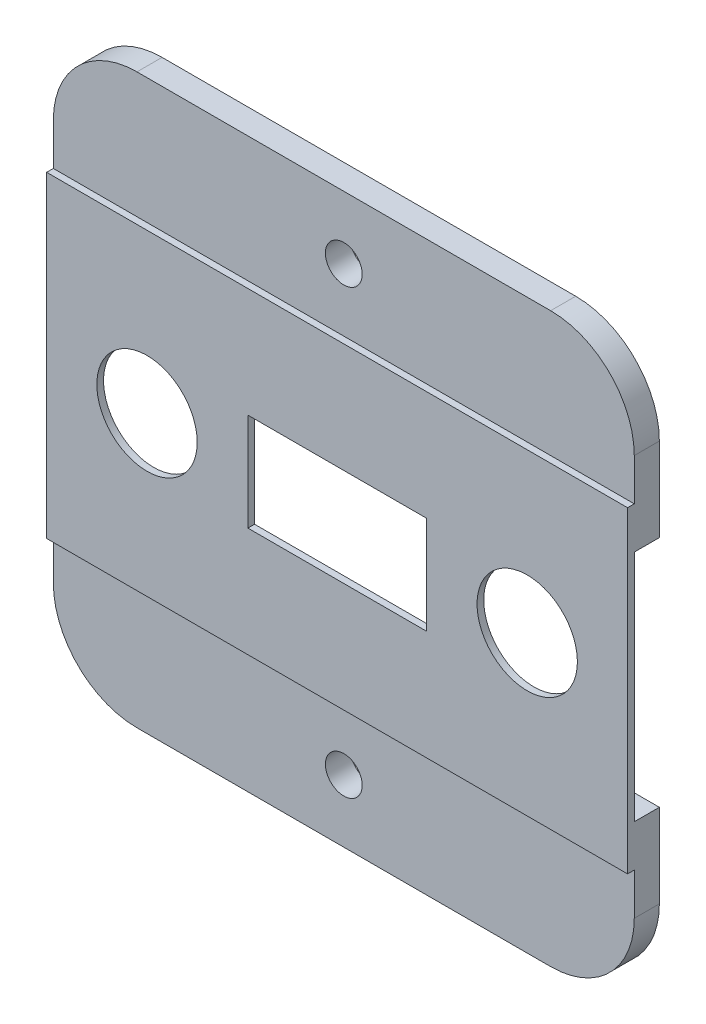
ISO-10303-21;
HEADER;
FILE_DESCRIPTION(('STEP AP214'),'2;1');
FILE_NAME('part.step','',(''),(''),'','','');
FILE_SCHEMA(('AUTOMOTIVE_DESIGN { 1 0 10303 214 1 1 1 1 }'));
ENDSEC;
DATA;
#1=APPLICATION_CONTEXT('core data for automotive mechanical design processes');
#2=APPLICATION_PROTOCOL_DEFINITION('international standard','automotive_design',2000,#1);
#3=PRODUCT_CONTEXT('',#1,'mechanical');
#4=PRODUCT('Part','Part','',(#3));
#5=PRODUCT_RELATED_PRODUCT_CATEGORY('part','',(#4));
#6=PRODUCT_DEFINITION_FORMATION('','',#4);
#7=PRODUCT_DEFINITION_CONTEXT('part definition',#1,'design');
#8=PRODUCT_DEFINITION('design','',#6,#7);
#9=PRODUCT_DEFINITION_SHAPE('','',#8);
#10=(LENGTH_UNIT() NAMED_UNIT(*) SI_UNIT(.MILLI.,.METRE.));
#11=(NAMED_UNIT(*) PLANE_ANGLE_UNIT() SI_UNIT($,.RADIAN.));
#12=(NAMED_UNIT(*) SI_UNIT($,.STERADIAN.) SOLID_ANGLE_UNIT());
#13=UNCERTAINTY_MEASURE_WITH_UNIT(LENGTH_MEASURE(1.E-05),#10,'distance_accuracy_value','');
#14=(GEOMETRIC_REPRESENTATION_CONTEXT(3) GLOBAL_UNCERTAINTY_ASSIGNED_CONTEXT((#13)) GLOBAL_UNIT_ASSIGNED_CONTEXT((#10,
#11,#12)) REPRESENTATION_CONTEXT('',''));
#15=CARTESIAN_POINT('',(0.,0.,0.));
#16=DIRECTION('',(0.,0.,1.));
#17=DIRECTION('',(1.,0.,0.));
#18=AXIS2_PLACEMENT_3D('',#15,#16,#17);
#19=CARTESIAN_POINT('',(0.,0.,1.90499999999993));
#20=DIRECTION('',(0.,0.,1.));
#21=DIRECTION('',(1.,0.,0.));
#22=AXIS2_PLACEMENT_3D('',#19,#20,#21);
#23=PLANE('',#22);
#24=CARTESIAN_POINT('',(-4.70269996774463,-10.6854,1.90499999999993));
#25=DIRECTION('',(0.,0.,1.));
#26=DIRECTION('',(1.,0.,0.));
#27=AXIS2_PLACEMENT_3D('',#24,#25,#26);
#28=CIRCLE('',#27,1.39699999999999);
#29=CARTESIAN_POINT('',(-3.30569996774464,-10.6854,1.90499999999993));
#30=VERTEX_POINT('',#29);
#31=EDGE_CURVE('E379',#30,#30,#28,.T.);
#32=ORIENTED_EDGE('',*,*,#31,.F.);
#33=EDGE_LOOP('',(#32));
#34=FACE_BOUND('',#33,.T.);
#35=DIRECTION('',(-1.,0.,0.));
#36=VECTOR('',#35,1.);
#37=CARTESIAN_POINT('',(17.3508500322554,-15.4479,1.90499999999993));
#38=LINE('',#37,#36);
#39=CARTESIAN_POINT('',(17.3508500322554,-15.4479,1.90499999999993));
#40=VERTEX_POINT('',#39);
#41=CARTESIAN_POINT('',(-26.7562499677446,-15.4479,1.90499999999993));
#42=VERTEX_POINT('',#41);
#43=EDGE_CURVE('E48',#40,#42,#38,.T.);
#44=ORIENTED_EDGE('',*,*,#43,.F.);
#45=DIRECTION('',(0.,1.,0.));
#46=VECTOR('',#45,1.);
#47=CARTESIAN_POINT('',(17.3508500322554,-18.6229,1.90499999999993));
#48=LINE('',#47,#46);
#49=CARTESIAN_POINT('',(17.3508500322554,-12.2729,1.90499999999993));
#50=VERTEX_POINT('',#49);
#51=EDGE_CURVE('E299',#40,#50,#48,.T.);
#52=ORIENTED_EDGE('',*,*,#51,.T.);
#53=CARTESIAN_POINT('',(11.0008500322554,-12.2729,1.90499999999993));
#54=DIRECTION('',(0.,0.,1.));
#55=DIRECTION('',(1.,0.,0.));
#56=AXIS2_PLACEMENT_3D('',#53,#54,#55);
#57=CIRCLE('',#56,6.35);
#58=CARTESIAN_POINT('',(11.0008500322554,-5.92289999999998,1.90499999999993));
#59=VERTEX_POINT('',#58);
#60=EDGE_CURVE('E320',#59,#50,#57,.F.);
#61=ORIENTED_EDGE('',*,*,#60,.F.);
#62=DIRECTION('',(1.,0.,0.));
#63=VECTOR('',#62,1.);
#64=CARTESIAN_POINT('',(-20.4062499677446,-5.92289999999999,1.90499999999993));
#65=LINE('',#64,#63);
#66=CARTESIAN_POINT('',(-20.4062499677446,-5.92289999999999,1.90499999999993));
#67=VERTEX_POINT('',#66);
#68=EDGE_CURVE('E325',#67,#59,#65,.T.);
#69=ORIENTED_EDGE('',*,*,#68,.F.);
#70=CARTESIAN_POINT('',(-20.4062499677446,-12.2729,1.90499999999993));
#71=DIRECTION('',(0.,0.,1.));
#72=DIRECTION('',(1.,0.,0.));
#73=AXIS2_PLACEMENT_3D('',#70,#71,#72);
#74=CIRCLE('',#73,6.35);
#75=CARTESIAN_POINT('',(-26.7562499677446,-12.2729,1.90499999999993));
#76=VERTEX_POINT('',#75);
#77=EDGE_CURVE('E329',#76,#67,#74,.F.);
#78=ORIENTED_EDGE('',*,*,#77,.F.);
#79=DIRECTION('',(0.,1.,0.));
#80=VECTOR('',#79,1.);
#81=CARTESIAN_POINT('',(-26.7562499677446,-18.6229,1.90499999999993));
#82=LINE('',#81,#80);
#83=EDGE_CURVE('E333',#42,#76,#82,.T.);
#84=ORIENTED_EDGE('',*,*,#83,.F.);
#85=EDGE_LOOP('',(#44,#52,#61,#69,#78,#84));
#86=FACE_BOUND('',#85,.T.);
#87=ADVANCED_FACE('F33',(#34,#86),#23,.T.);
#88=CARTESIAN_POINT('',(11.0008500322554,-12.2729,0.));
#89=DIRECTION('',(0.,0.,-1.));
#90=DIRECTION('',(-1.,0.,0.));
#91=AXIS2_PLACEMENT_3D('',#88,#89,#90);
#92=PLANE('',#91);
#93=CARTESIAN_POINT('',(-4.70269996774463,-10.6854,0.));
#94=DIRECTION('',(0.,0.,1.));
#95=DIRECTION('',(1.,0.,0.));
#96=AXIS2_PLACEMENT_3D('',#93,#94,#95);
#97=CIRCLE('',#96,1.397);
#98=CARTESIAN_POINT('',(-3.30569996774463,-10.6854,0.));
#99=VERTEX_POINT('',#98);
#100=EDGE_CURVE('E381',#99,#99,#97,.T.);
#101=ORIENTED_EDGE('',*,*,#100,.T.);
#102=EDGE_LOOP('',(#101));
#103=FACE_BOUND('',#102,.T.);
#104=DIRECTION('',(0.,1.,0.));
#105=VECTOR('',#104,1.);
#106=CARTESIAN_POINT('',(17.3508500322554,-18.6229,0.));
#107=LINE('',#106,#105);
#108=CARTESIAN_POINT('',(17.3508500322554,-18.6229,0.));
#109=VERTEX_POINT('',#108);
#110=CARTESIAN_POINT('',(17.3508500322554,-12.2729,0.));
#111=VERTEX_POINT('',#110);
#112=EDGE_CURVE('E11',#109,#111,#107,.T.);
#113=ORIENTED_EDGE('',*,*,#112,.F.);
#114=DIRECTION('',(-1.,0.,0.));
#115=VECTOR('',#114,1.);
#116=CARTESIAN_POINT('',(17.3508500322554,-18.6229,0.));
#117=LINE('',#116,#115);
#118=CARTESIAN_POINT('',(-26.7562499677446,-18.6229,0.));
#119=VERTEX_POINT('',#118);
#120=EDGE_CURVE('E300',#109,#119,#117,.T.);
#121=ORIENTED_EDGE('',*,*,#120,.T.);
#122=DIRECTION('',(0.,1.,0.));
#123=VECTOR('',#122,1.);
#124=CARTESIAN_POINT('',(-26.7562499677446,-18.6229,0.));
#125=LINE('',#124,#123);
#126=CARTESIAN_POINT('',(-26.7562499677446,-12.2729,0.));
#127=VERTEX_POINT('',#126);
#128=EDGE_CURVE('E303',#119,#127,#125,.T.);
#129=ORIENTED_EDGE('',*,*,#128,.T.);
#130=CARTESIAN_POINT('',(-20.4062499677446,-12.2729,0.));
#131=DIRECTION('',(0.,0.,-1.));
#132=DIRECTION('',(-1.,0.,0.));
#133=AXIS2_PLACEMENT_3D('',#130,#131,#132);
#134=CIRCLE('',#133,6.35);
#135=CARTESIAN_POINT('',(-20.4062499677446,-5.92289999999999,0.));
#136=VERTEX_POINT('',#135);
#137=EDGE_CURVE('E306',#127,#136,#134,.T.);
#138=ORIENTED_EDGE('',*,*,#137,.T.);
#139=DIRECTION('',(1.,0.,0.));
#140=VECTOR('',#139,1.);
#141=CARTESIAN_POINT('',(-20.4062499677446,-5.92289999999999,0.));
#142=LINE('',#141,#140);
#143=CARTESIAN_POINT('',(11.0008500322554,-5.92289999999998,0.));
#144=VERTEX_POINT('',#143);
#145=EDGE_CURVE('E309',#136,#144,#142,.T.);
#146=ORIENTED_EDGE('',*,*,#145,.T.);
#147=CARTESIAN_POINT('',(11.0008500322554,-12.2729,0.));
#148=DIRECTION('',(0.,0.,-1.));
#149=DIRECTION('',(-1.,0.,0.));
#150=AXIS2_PLACEMENT_3D('',#147,#148,#149);
#151=CIRCLE('',#150,6.35);
#152=EDGE_CURVE('E312',#144,#111,#151,.T.);
#153=ORIENTED_EDGE('',*,*,#152,.T.);
#154=EDGE_LOOP('',(#113,#121,#129,#138,#146,#153));
#155=FACE_BOUND('',#154,.T.);
#156=ADVANCED_FACE('F347',(#103,#155),#92,.T.);
#157=CARTESIAN_POINT('',(17.3508500322554,-18.6229,48.1850879039006));
#158=DIRECTION('',(0.,-1.,0.));
#159=DIRECTION('',(1.,0.,0.));
#160=AXIS2_PLACEMENT_3D('',#157,#158,#159);
#161=PLANE('',#160);
#162=DIRECTION('',(0.,0.,-1.));
#163=VECTOR('',#162,1.);
#164=CARTESIAN_POINT('',(17.3508500322554,-18.6229,48.1850879039006));
#165=LINE('',#164,#163);
#166=CARTESIAN_POINT('',(17.3508500322554,-18.6229,1.90499999999993));
#167=VERTEX_POINT('',#166);
#168=EDGE_CURVE('E36',#167,#109,#165,.T.);
#169=ORIENTED_EDGE('',*,*,#168,.F.);
#170=DIRECTION('',(-1.,0.,0.));
#171=VECTOR('',#170,1.);
#172=CARTESIAN_POINT('',(17.3508500322554,-18.6229,1.90499999999993));
#173=LINE('',#172,#171);
#174=CARTESIAN_POINT('',(-26.7562499677446,-18.6229,1.90499999999993));
#175=VERTEX_POINT('',#174);
#176=EDGE_CURVE('E314',#167,#175,#173,.T.);
#177=ORIENTED_EDGE('',*,*,#176,.T.);
#178=DIRECTION('',(0.,0.,-1.));
#179=VECTOR('',#178,1.);
#180=CARTESIAN_POINT('',(-26.7562499677446,-18.6229,48.1850879039006));
#181=LINE('',#180,#179);
#182=EDGE_CURVE('E318',#175,#119,#181,.T.);
#183=ORIENTED_EDGE('',*,*,#182,.T.);
#184=ORIENTED_EDGE('',*,*,#120,.F.);
#185=EDGE_LOOP('',(#169,#177,#183,#184));
#186=FACE_BOUND('',#185,.T.);
#187=ADVANCED_FACE('F341',(#186),#161,.T.);
#188=CARTESIAN_POINT('',(-26.7562499677446,-18.6229,48.1850879039006));
#189=DIRECTION('',(-1.,0.,0.));
#190=DIRECTION('',(0.,0.,1.));
#191=AXIS2_PLACEMENT_3D('',#188,#189,#190);
#192=PLANE('',#191);
#193=ORIENTED_EDGE('',*,*,#182,.F.);
#194=DIRECTION('',(0.,-1.,0.));
#195=VECTOR('',#194,1.);
#196=CARTESIAN_POINT('',(-26.7562499677446,-15.4479,1.90499999999993));
#197=LINE('',#196,#195);
#198=CARTESIAN_POINT('',(-26.7562499677446,-36.3520999999999,1.90499999999993));
#199=VERTEX_POINT('',#198);
#200=EDGE_CURVE('E285',#175,#199,#197,.T.);
#201=ORIENTED_EDGE('',*,*,#200,.T.);
#202=DIRECTION('',(0.,0.,-1.));
#203=VECTOR('',#202,1.);
#204=CARTESIAN_POINT('',(-26.7562499677446,-36.3520999999999,48.1850879039006));
#205=LINE('',#204,#203);
#206=CARTESIAN_POINT('',(-26.7562499677446,-36.3520999999999,0.));
#207=VERTEX_POINT('',#206);
#208=EDGE_CURVE('E225',#199,#207,#205,.T.);
#209=ORIENTED_EDGE('',*,*,#208,.T.);
#210=DIRECTION('',(0.,-1.,0.));
#211=VECTOR('',#210,1.);
#212=CARTESIAN_POINT('',(-26.7562499677446,-36.3520999999999,0.));
#213=LINE('',#212,#211);
#214=CARTESIAN_POINT('',(-26.7562499677446,-42.7020999999999,0.));
#215=VERTEX_POINT('',#214);
#216=EDGE_CURVE('E194',#207,#215,#213,.T.);
#217=ORIENTED_EDGE('',*,*,#216,.T.);
#218=DIRECTION('',(0.,0.,-1.));
#219=VECTOR('',#218,1.);
#220=CARTESIAN_POINT('',(-26.7562499677446,-42.7020999999999,48.1850879039006));
#221=LINE('',#220,#219);
#222=CARTESIAN_POINT('',(-26.7562499677446,-42.7020999999999,1.90499999999993));
#223=VERTEX_POINT('',#222);
#224=EDGE_CURVE('E190',#223,#215,#221,.T.);
#225=ORIENTED_EDGE('',*,*,#224,.F.);
#226=DIRECTION('',(0.,-1.,0.));
#227=VECTOR('',#226,1.);
#228=CARTESIAN_POINT('',(-26.7562499677446,-36.3520999999999,1.90499999999993));
#229=LINE('',#228,#227);
#230=CARTESIAN_POINT('',(-26.7562499677446,-39.5270999999999,1.90499999999993));
#231=VERTEX_POINT('',#230);
#232=EDGE_CURVE('E175',#231,#223,#229,.T.);
#233=ORIENTED_EDGE('',*,*,#232,.F.);
#234=DIRECTION('',(0.,0.,-1.));
#235=VECTOR('',#234,1.);
#236=CARTESIAN_POINT('',(-26.7562499677446,-39.5270999999999,2.41299999999993));
#237=LINE('',#236,#235);
#238=CARTESIAN_POINT('',(-26.7562499677446,-39.5270999999999,2.41299999999993));
#239=VERTEX_POINT('',#238);
#240=EDGE_CURVE('E291',#239,#231,#237,.T.);
#241=ORIENTED_EDGE('',*,*,#240,.F.);
#242=DIRECTION('',(0.,-1.,0.));
#243=VECTOR('',#242,1.);
#244=CARTESIAN_POINT('',(-26.7562499677446,-15.4479,2.41299999999993));
#245=LINE('',#244,#243);
#246=CARTESIAN_POINT('',(-26.7562499677446,-15.4479,2.41299999999993));
#247=VERTEX_POINT('',#246);
#248=EDGE_CURVE('E278',#247,#239,#245,.T.);
#249=ORIENTED_EDGE('',*,*,#248,.F.);
#250=DIRECTION('',(0.,0.,-1.));
#251=VECTOR('',#250,1.);
#252=CARTESIAN_POINT('',(-26.7562499677446,-15.4479,2.41299999999993));
#253=LINE('',#252,#251);
#254=EDGE_CURVE('E293',#247,#42,#253,.T.);
#255=ORIENTED_EDGE('',*,*,#254,.T.);
#256=ORIENTED_EDGE('',*,*,#83,.T.);
#257=DIRECTION('',(0.,0.,-1.));
#258=VECTOR('',#257,1.);
#259=CARTESIAN_POINT('',(-26.7562499677446,-12.2729,48.1850879039006));
#260=LINE('',#259,#258);
#261=EDGE_CURVE('E332',#76,#127,#260,.T.);
#262=ORIENTED_EDGE('',*,*,#261,.T.);
#263=ORIENTED_EDGE('',*,*,#128,.F.);
#264=EDGE_LOOP('',(#193,#201,#209,#217,#225,#233,#241,#249,#255,#256,#262,#263));
#265=FACE_BOUND('',#264,.T.);
#266=ADVANCED_FACE('F192',(#265),#192,.T.);
#267=CARTESIAN_POINT('',(-20.4062499677446,-12.2729,48.1850879039006));
#268=DIRECTION('',(0.,0.,-1.));
#269=DIRECTION('',(-1.,0.,0.));
#270=AXIS2_PLACEMENT_3D('',#267,#268,#269);
#271=CYLINDRICAL_SURFACE('',#270,6.35);
#272=ORIENTED_EDGE('',*,*,#261,.F.);
#273=ORIENTED_EDGE('',*,*,#77,.T.);
#274=DIRECTION('',(0.,0.,-1.));
#275=VECTOR('',#274,1.);
#276=CARTESIAN_POINT('',(-20.4062499677446,-5.92289999999999,48.1850879039006));
#277=LINE('',#276,#275);
#278=EDGE_CURVE('E328',#67,#136,#277,.T.);
#279=ORIENTED_EDGE('',*,*,#278,.T.);
#280=ORIENTED_EDGE('',*,*,#137,.F.);
#281=EDGE_LOOP('',(#272,#273,#279,#280));
#282=FACE_BOUND('',#281,.T.);
#283=ADVANCED_FACE('F361',(#282),#271,.T.);
#284=CARTESIAN_POINT('',(-20.4062499677446,-5.92289999999999,48.1850879039006));
#285=DIRECTION('',(0.,1.,0.));
#286=DIRECTION('',(-1.,0.,0.));
#287=AXIS2_PLACEMENT_3D('',#284,#285,#286);
#288=PLANE('',#287);
#289=ORIENTED_EDGE('',*,*,#278,.F.);
#290=ORIENTED_EDGE('',*,*,#68,.T.);
#291=DIRECTION('',(0.,0.,-1.));
#292=VECTOR('',#291,1.);
#293=CARTESIAN_POINT('',(11.0008500322554,-5.92289999999998,48.1850879039006));
#294=LINE('',#293,#292);
#295=EDGE_CURVE('E324',#59,#144,#294,.T.);
#296=ORIENTED_EDGE('',*,*,#295,.T.);
#297=ORIENTED_EDGE('',*,*,#145,.F.);
#298=EDGE_LOOP('',(#289,#290,#296,#297));
#299=FACE_BOUND('',#298,.T.);
#300=ADVANCED_FACE('F359',(#299),#288,.T.);
#301=CARTESIAN_POINT('',(11.0008500322554,-12.2729,48.1850879039006));
#302=DIRECTION('',(0.,0.,-1.));
#303=DIRECTION('',(-1.,0.,0.));
#304=AXIS2_PLACEMENT_3D('',#301,#302,#303);
#305=CYLINDRICAL_SURFACE('',#304,6.35);
#306=ORIENTED_EDGE('',*,*,#295,.F.);
#307=ORIENTED_EDGE('',*,*,#60,.T.);
#308=DIRECTION('',(0.,0.,-1.));
#309=VECTOR('',#308,1.);
#310=CARTESIAN_POINT('',(17.3508500322554,-12.2729,48.1850879039006));
#311=LINE('',#310,#309);
#312=EDGE_CURVE('E323',#50,#111,#311,.T.);
#313=ORIENTED_EDGE('',*,*,#312,.T.);
#314=ORIENTED_EDGE('',*,*,#152,.F.);
#315=EDGE_LOOP('',(#306,#307,#313,#314));
#316=FACE_BOUND('',#315,.T.);
#317=ADVANCED_FACE('F354',(#316),#305,.T.);
#318=CARTESIAN_POINT('',(17.3508500322554,-18.6229,48.1850879039006));
#319=DIRECTION('',(-1.,0.,0.));
#320=DIRECTION('',(0.,-1.,0.));
#321=AXIS2_PLACEMENT_3D('',#318,#319,#320);
#322=PLANE('',#321);
#323=ORIENTED_EDGE('',*,*,#51,.F.);
#324=DIRECTION('',(0.,0.,-1.));
#325=VECTOR('',#324,1.);
#326=CARTESIAN_POINT('',(17.3508500322554,-15.4479,2.41299999999993));
#327=LINE('',#326,#325);
#328=CARTESIAN_POINT('',(17.3508500322554,-15.4479,2.41299999999993));
#329=VERTEX_POINT('',#328);
#330=EDGE_CURVE('E296',#329,#40,#327,.T.);
#331=ORIENTED_EDGE('',*,*,#330,.F.);
#332=DIRECTION('',(0.,1.,0.));
#333=VECTOR('',#332,1.);
#334=CARTESIAN_POINT('',(17.3508500322554,-39.5270999999999,2.41299999999993));
#335=LINE('',#334,#333);
#336=CARTESIAN_POINT('',(17.3508500322554,-39.5270999999999,2.41299999999993));
#337=VERTEX_POINT('',#336);
#338=EDGE_CURVE('E273',#337,#329,#335,.T.);
#339=ORIENTED_EDGE('',*,*,#338,.F.);
#340=DIRECTION('',(0.,0.,-1.));
#341=VECTOR('',#340,1.);
#342=CARTESIAN_POINT('',(17.3508500322554,-39.5270999999999,2.41299999999993));
#343=LINE('',#342,#341);
#344=CARTESIAN_POINT('',(17.3508500322554,-39.5270999999999,1.90499999999993));
#345=VERTEX_POINT('',#344);
#346=EDGE_CURVE('E282',#337,#345,#343,.T.);
#347=ORIENTED_EDGE('',*,*,#346,.T.);
#348=DIRECTION('',(0.,-1.,0.));
#349=VECTOR('',#348,1.);
#350=CARTESIAN_POINT('',(17.3508500322554,-36.3520999999999,1.90499999999993));
#351=LINE('',#350,#349);
#352=CARTESIAN_POINT('',(17.3508500322554,-42.7020999999999,1.90499999999993));
#353=VERTEX_POINT('',#352);
#354=EDGE_CURVE('E214',#345,#353,#351,.T.);
#355=ORIENTED_EDGE('',*,*,#354,.T.);
#356=DIRECTION('',(0.,0.,-1.));
#357=VECTOR('',#356,1.);
#358=CARTESIAN_POINT('',(17.3508500322554,-42.7020999999999,48.1850879039006));
#359=LINE('',#358,#357);
#360=CARTESIAN_POINT('',(17.3508500322554,-42.7020999999999,0.));
#361=VERTEX_POINT('',#360);
#362=EDGE_CURVE('E217',#353,#361,#359,.T.);
#363=ORIENTED_EDGE('',*,*,#362,.T.);
#364=DIRECTION('',(0.,-1.,0.));
#365=VECTOR('',#364,1.);
#366=CARTESIAN_POINT('',(17.3508500322554,-36.3520999999999,0.));
#367=LINE('',#366,#365);
#368=CARTESIAN_POINT('',(17.3508500322554,-36.3520999999999,0.));
#369=VERTEX_POINT('',#368);
#370=EDGE_CURVE('E211',#369,#361,#367,.T.);
#371=ORIENTED_EDGE('',*,*,#370,.F.);
#372=DIRECTION('',(0.,0.,-1.));
#373=VECTOR('',#372,1.);
#374=CARTESIAN_POINT('',(17.3508500322554,-36.3520999999999,48.1850879039006));
#375=LINE('',#374,#373);
#376=CARTESIAN_POINT('',(17.3508500322554,-36.3520999999999,1.90499999999993));
#377=VERTEX_POINT('',#376);
#378=EDGE_CURVE('E220',#377,#369,#375,.T.);
#379=ORIENTED_EDGE('',*,*,#378,.F.);
#380=DIRECTION('',(0.,1.,0.));
#381=VECTOR('',#380,1.);
#382=CARTESIAN_POINT('',(17.3508500322554,-39.5270999999999,1.90499999999993));
#383=LINE('',#382,#381);
#384=EDGE_CURVE('E89',#377,#167,#383,.T.);
#385=ORIENTED_EDGE('',*,*,#384,.T.);
#386=ORIENTED_EDGE('',*,*,#168,.T.);
#387=ORIENTED_EDGE('',*,*,#112,.T.);
#388=ORIENTED_EDGE('',*,*,#312,.F.);
#389=EDGE_LOOP('',(#323,#331,#339,#347,#355,#363,#371,#379,#385,#386,#387,#388));
#390=FACE_BOUND('',#389,.T.);
#391=ADVANCED_FACE('F350',(#390),#322,.F.);
#392=CARTESIAN_POINT('',(0.,0.,2.41299999999993));
#393=DIRECTION('',(0.,0.,1.));
#394=DIRECTION('',(1.,0.,0.));
#395=AXIS2_PLACEMENT_3D('',#392,#393,#394);
#396=PLANE('',#395);
#397=CARTESIAN_POINT('',(9.73085003225536,-27.4875,2.41299999999993));
#398=DIRECTION('',(0.,0.,1.));
#399=DIRECTION('',(1.,0.,0.));
#400=AXIS2_PLACEMENT_3D('',#397,#398,#399);
#401=CIRCLE('',#400,3.81);
#402=CARTESIAN_POINT('',(13.5408500322554,-27.4875,2.41299999999993));
#403=VERTEX_POINT('',#402);
#404=EDGE_CURVE('E239',#403,#403,#401,.T.);
#405=ORIENTED_EDGE('',*,*,#404,.F.);
#406=EDGE_LOOP('',(#405));
#407=FACE_BOUND('',#406,.T.);
#408=ORIENTED_EDGE('',*,*,#338,.T.);
#409=DIRECTION('',(-1.,0.,0.));
#410=VECTOR('',#409,1.);
#411=CARTESIAN_POINT('',(17.3508500322554,-15.4479,2.41299999999993));
#412=LINE('',#411,#410);
#413=EDGE_CURVE('E276',#329,#247,#412,.T.);
#414=ORIENTED_EDGE('',*,*,#413,.T.);
#415=ORIENTED_EDGE('',*,*,#248,.T.);
#416=DIRECTION('',(1.,0.,0.));
#417=VECTOR('',#416,1.);
#418=CARTESIAN_POINT('',(-26.7562499677446,-39.5270999999999,2.41299999999993));
#419=LINE('',#418,#417);
#420=EDGE_CURVE('E280',#239,#337,#419,.T.);
#421=ORIENTED_EDGE('',*,*,#420,.T.);
#422=EDGE_LOOP('',(#408,#414,#415,#421));
#423=FACE_BOUND('',#422,.T.);
#424=DIRECTION('',(0.,-1.,0.));
#425=VECTOR('',#424,1.);
#426=CARTESIAN_POINT('',(-11.4781499677446,-23.77275,2.41299999999993));
#427=LINE('',#426,#425);
#428=CARTESIAN_POINT('',(-11.4781499677446,-23.77275,2.41299999999993));
#429=VERTEX_POINT('',#428);
#430=CARTESIAN_POINT('',(-11.4781499677446,-31.20225,2.41299999999993));
#431=VERTEX_POINT('',#430);
#432=EDGE_CURVE('E247',#429,#431,#427,.T.);
#433=ORIENTED_EDGE('',*,*,#432,.F.);
#434=DIRECTION('',(-1.,0.,0.));
#435=VECTOR('',#434,1.);
#436=CARTESIAN_POINT('',(2.07275003225538,-23.77275,2.41299999999993));
#437=LINE('',#436,#435);
#438=CARTESIAN_POINT('',(2.07275003225538,-23.77275,2.41299999999993));
#439=VERTEX_POINT('',#438);
#440=EDGE_CURVE('E245',#439,#429,#437,.T.);
#441=ORIENTED_EDGE('',*,*,#440,.F.);
#442=DIRECTION('',(0.,1.,0.));
#443=VECTOR('',#442,1.);
#444=CARTESIAN_POINT('',(2.07275003225538,-31.20225,2.41299999999993));
#445=LINE('',#444,#443);
#446=CARTESIAN_POINT('',(2.07275003225538,-31.20225,2.41299999999993));
#447=VERTEX_POINT('',#446);
#448=EDGE_CURVE('E252',#447,#439,#445,.T.);
#449=ORIENTED_EDGE('',*,*,#448,.F.);
#450=DIRECTION('',(1.,0.,0.));
#451=VECTOR('',#450,1.);
#452=CARTESIAN_POINT('',(-11.4781499677446,-31.20225,2.41299999999993));
#453=LINE('',#452,#451);
#454=EDGE_CURVE('E250',#431,#447,#453,.T.);
#455=ORIENTED_EDGE('',*,*,#454,.F.);
#456=EDGE_LOOP('',(#433,#441,#449,#455));
#457=FACE_BOUND('',#456,.T.);
#458=CARTESIAN_POINT('',(-19.1362499677446,-27.4875,2.41299999999993));
#459=DIRECTION('',(0.,0.,1.));
#460=DIRECTION('',(1.,0.,0.));
#461=AXIS2_PLACEMENT_3D('',#458,#459,#460);
#462=CIRCLE('',#461,3.81);
#463=CARTESIAN_POINT('',(-15.3262499677446,-27.4875,2.41299999999993));
#464=VERTEX_POINT('',#463);
#465=EDGE_CURVE('E205',#464,#464,#462,.T.);
#466=ORIENTED_EDGE('',*,*,#465,.F.);
#467=EDGE_LOOP('',(#466));
#468=FACE_BOUND('',#467,.T.);
#469=ADVANCED_FACE('F411',(#407,#423,#457,#468),#396,.T.);
#470=CARTESIAN_POINT('',(0.,0.,1.90499999999993));
#471=DIRECTION('',(0.,0.,1.));
#472=DIRECTION('',(1.,0.,0.));
#473=AXIS2_PLACEMENT_3D('',#470,#471,#472);
#474=PLANE('',#473);
#475=ORIENTED_EDGE('',*,*,#384,.F.);
#476=DIRECTION('',(1.,0.,0.));
#477=VECTOR('',#476,1.);
#478=CARTESIAN_POINT('',(-26.7562499677446,-36.3520999999999,1.90499999999993));
#479=LINE('',#478,#477);
#480=EDGE_CURVE('E218',#199,#377,#479,.T.);
#481=ORIENTED_EDGE('',*,*,#480,.F.);
#482=ORIENTED_EDGE('',*,*,#200,.F.);
#483=ORIENTED_EDGE('',*,*,#176,.F.);
#484=EDGE_LOOP('',(#475,#481,#482,#483));
#485=FACE_BOUND('',#484,.T.);
#486=DIRECTION('',(-1.,0.,0.));
#487=VECTOR('',#486,1.);
#488=CARTESIAN_POINT('',(2.07275003225538,-23.77275,1.90499999999993));
#489=LINE('',#488,#487);
#490=CARTESIAN_POINT('',(2.07275003225538,-23.77275,1.90499999999993));
#491=VERTEX_POINT('',#490);
#492=CARTESIAN_POINT('',(-11.4781499677446,-23.77275,1.90499999999993));
#493=VERTEX_POINT('',#492);
#494=EDGE_CURVE('E242',#491,#493,#489,.T.);
#495=ORIENTED_EDGE('',*,*,#494,.T.);
#496=DIRECTION('',(0.,-1.,0.));
#497=VECTOR('',#496,1.);
#498=CARTESIAN_POINT('',(-11.4781499677446,-30.26245,1.90499999999993));
#499=LINE('',#498,#497);
#500=CARTESIAN_POINT('',(-11.4781499677446,-31.20225,1.90499999999993));
#501=VERTEX_POINT('',#500);
#502=EDGE_CURVE('E257',#493,#501,#499,.T.);
#503=ORIENTED_EDGE('',*,*,#502,.T.);
#504=DIRECTION('',(1.,0.,0.));
#505=VECTOR('',#504,1.);
#506=CARTESIAN_POINT('',(-11.4781499677446,-31.20225,1.90499999999993));
#507=LINE('',#506,#505);
#508=CARTESIAN_POINT('',(2.07275003225538,-31.20225,1.90499999999993));
#509=VERTEX_POINT('',#508);
#510=EDGE_CURVE('E260',#501,#509,#507,.T.);
#511=ORIENTED_EDGE('',*,*,#510,.T.);
#512=DIRECTION('',(0.,1.,0.));
#513=VECTOR('',#512,1.);
#514=CARTESIAN_POINT('',(2.07275003225538,-31.20225,1.90499999999993));
#515=LINE('',#514,#513);
#516=EDGE_CURVE('E248',#509,#491,#515,.T.);
#517=ORIENTED_EDGE('',*,*,#516,.T.);
#518=EDGE_LOOP('',(#495,#503,#511,#517));
#519=FACE_BOUND('',#518,.T.);
#520=CARTESIAN_POINT('',(9.73085003225536,-27.4875,1.90499999999993));
#521=DIRECTION('',(0.,0.,1.));
#522=DIRECTION('',(1.,0.,0.));
#523=AXIS2_PLACEMENT_3D('',#520,#521,#522);
#524=CIRCLE('',#523,3.81);
#525=CARTESIAN_POINT('',(13.5408500322554,-27.4875,1.90499999999993));
#526=VERTEX_POINT('',#525);
#527=EDGE_CURVE('E237',#526,#526,#524,.T.);
#528=ORIENTED_EDGE('',*,*,#527,.T.);
#529=EDGE_LOOP('',(#528));
#530=FACE_BOUND('',#529,.T.);
#531=CARTESIAN_POINT('',(-19.1362499677446,-27.4875,1.90499999999993));
#532=DIRECTION('',(0.,0.,1.));
#533=DIRECTION('',(1.,0.,0.));
#534=AXIS2_PLACEMENT_3D('',#531,#532,#533);
#535=CIRCLE('',#534,3.81);
#536=CARTESIAN_POINT('',(-15.3262499677446,-27.4875,1.90499999999993));
#537=VERTEX_POINT('',#536);
#538=EDGE_CURVE('E202',#537,#537,#535,.T.);
#539=ORIENTED_EDGE('',*,*,#538,.T.);
#540=EDGE_LOOP('',(#539));
#541=FACE_BOUND('',#540,.T.);
#542=ADVANCED_FACE('F418',(#485,#519,#530,#541),#474,.F.);
#543=CARTESIAN_POINT('',(17.3508500322554,-15.4479,2.41299999999993));
#544=DIRECTION('',(0.,-1.,0.));
#545=DIRECTION('',(1.,0.,0.));
#546=AXIS2_PLACEMENT_3D('',#543,#544,#545);
#547=PLANE('',#546);
#548=ORIENTED_EDGE('',*,*,#43,.T.);
#549=ORIENTED_EDGE('',*,*,#254,.F.);
#550=ORIENTED_EDGE('',*,*,#413,.F.);
#551=ORIENTED_EDGE('',*,*,#330,.T.);
#552=EDGE_LOOP('',(#548,#549,#550,#551));
#553=FACE_BOUND('',#552,.T.);
#554=ADVANCED_FACE('F416',(#553),#547,.F.);
#555=CARTESIAN_POINT('',(-26.7562499677446,-39.5270999999999,2.41299999999993));
#556=DIRECTION('',(0.,1.,0.));
#557=DIRECTION('',(-1.,0.,0.));
#558=AXIS2_PLACEMENT_3D('',#555,#556,#557);
#559=PLANE('',#558);
#560=DIRECTION('',(1.,0.,0.));
#561=VECTOR('',#560,1.);
#562=CARTESIAN_POINT('',(-26.7562499677446,-39.5270999999999,1.90499999999993));
#563=LINE('',#562,#561);
#564=EDGE_CURVE('E182',#231,#345,#563,.T.);
#565=ORIENTED_EDGE('',*,*,#564,.T.);
#566=ORIENTED_EDGE('',*,*,#346,.F.);
#567=ORIENTED_EDGE('',*,*,#420,.F.);
#568=ORIENTED_EDGE('',*,*,#240,.T.);
#569=EDGE_LOOP('',(#565,#566,#567,#568));
#570=FACE_BOUND('',#569,.T.);
#571=ADVANCED_FACE('F407',(#570),#559,.F.);
#572=CARTESIAN_POINT('',(2.07275003225538,-23.77275,2.41299999999993));
#573=DIRECTION('',(0.,-1.,0.));
#574=DIRECTION('',(0.,0.,-1.));
#575=AXIS2_PLACEMENT_3D('',#572,#573,#574);
#576=PLANE('',#575);
#577=ORIENTED_EDGE('',*,*,#494,.F.);
#578=DIRECTION('',(0.,0.,-1.));
#579=VECTOR('',#578,1.);
#580=CARTESIAN_POINT('',(2.07275003225538,-23.77275,2.41299999999993));
#581=LINE('',#580,#579);
#582=EDGE_CURVE('E254',#439,#491,#581,.T.);
#583=ORIENTED_EDGE('',*,*,#582,.F.);
#584=ORIENTED_EDGE('',*,*,#440,.T.);
#585=DIRECTION('',(0.,0.,-1.));
#586=VECTOR('',#585,1.);
#587=CARTESIAN_POINT('',(-11.4781499677446,-23.77275,2.41299999999993));
#588=LINE('',#587,#586);
#589=EDGE_CURVE('E270',#429,#493,#588,.T.);
#590=ORIENTED_EDGE('',*,*,#589,.T.);
#591=EDGE_LOOP('',(#577,#583,#584,#590));
#592=FACE_BOUND('',#591,.T.);
#593=ADVANCED_FACE('F424',(#592),#576,.T.);
#594=CARTESIAN_POINT('',(-11.4781499677446,-30.26245,2.41299999999993));
#595=DIRECTION('',(1.,0.,0.));
#596=DIRECTION('',(0.,0.,-1.));
#597=AXIS2_PLACEMENT_3D('',#594,#595,#596);
#598=PLANE('',#597);
#599=ORIENTED_EDGE('',*,*,#502,.F.);
#600=ORIENTED_EDGE('',*,*,#589,.F.);
#601=ORIENTED_EDGE('',*,*,#432,.T.);
#602=DIRECTION('',(0.,0.,-1.));
#603=VECTOR('',#602,1.);
#604=CARTESIAN_POINT('',(-11.4781499677446,-31.20225,2.41299999999993));
#605=LINE('',#604,#603);
#606=EDGE_CURVE('E268',#431,#501,#605,.T.);
#607=ORIENTED_EDGE('',*,*,#606,.T.);
#608=EDGE_LOOP('',(#599,#600,#601,#607));
#609=FACE_BOUND('',#608,.T.);
#610=ADVANCED_FACE('F473',(#609),#598,.T.);
#611=CARTESIAN_POINT('',(-11.4781499677446,-31.20225,2.41299999999993));
#612=DIRECTION('',(0.,1.,0.));
#613=DIRECTION('',(0.,0.,1.));
#614=AXIS2_PLACEMENT_3D('',#611,#612,#613);
#615=PLANE('',#614);
#616=ORIENTED_EDGE('',*,*,#510,.F.);
#617=ORIENTED_EDGE('',*,*,#606,.F.);
#618=ORIENTED_EDGE('',*,*,#454,.T.);
#619=DIRECTION('',(0.,0.,-1.));
#620=VECTOR('',#619,1.);
#621=CARTESIAN_POINT('',(2.07275003225538,-31.20225,2.41299999999993));
#622=LINE('',#621,#620);
#623=EDGE_CURVE('E96',#447,#509,#622,.T.);
#624=ORIENTED_EDGE('',*,*,#623,.T.);
#625=EDGE_LOOP('',(#616,#617,#618,#624));
#626=FACE_BOUND('',#625,.T.);
#627=ADVANCED_FACE('F484',(#626),#615,.T.);
#628=CARTESIAN_POINT('',(2.07275003225538,-31.20225,2.41299999999993));
#629=DIRECTION('',(-1.,0.,0.));
#630=DIRECTION('',(0.,0.,1.));
#631=AXIS2_PLACEMENT_3D('',#628,#629,#630);
#632=PLANE('',#631);
#633=ORIENTED_EDGE('',*,*,#516,.F.);
#634=ORIENTED_EDGE('',*,*,#623,.F.);
#635=ORIENTED_EDGE('',*,*,#448,.T.);
#636=ORIENTED_EDGE('',*,*,#582,.T.);
#637=EDGE_LOOP('',(#633,#634,#635,#636));
#638=FACE_BOUND('',#637,.T.);
#639=ADVANCED_FACE('F495',(#638),#632,.T.);
#640=CARTESIAN_POINT('',(9.73085003225536,-27.4875,2.41299999999993));
#641=DIRECTION('',(0.,0.,-1.));
#642=DIRECTION('',(-1.,0.,0.));
#643=AXIS2_PLACEMENT_3D('',#640,#641,#642);
#644=CYLINDRICAL_SURFACE('',#643,3.81);
#645=ORIENTED_EDGE('',*,*,#404,.T.);
#646=EDGE_LOOP('',(#645));
#647=FACE_BOUND('',#646,.T.);
#648=ORIENTED_EDGE('',*,*,#527,.F.);
#649=EDGE_LOOP('',(#648));
#650=FACE_BOUND('',#649,.T.);
#651=ADVANCED_FACE('F505',(#647,#650),#644,.F.);
#652=CARTESIAN_POINT('',(-19.1362499677446,-27.4875,2.41299999999993));
#653=DIRECTION('',(0.,0.,-1.));
#654=DIRECTION('',(-1.,0.,0.));
#655=AXIS2_PLACEMENT_3D('',#652,#653,#654);
#656=CYLINDRICAL_SURFACE('',#655,3.81);
#657=ORIENTED_EDGE('',*,*,#465,.T.);
#658=EDGE_LOOP('',(#657));
#659=FACE_BOUND('',#658,.T.);
#660=ORIENTED_EDGE('',*,*,#538,.F.);
#661=EDGE_LOOP('',(#660));
#662=FACE_BOUND('',#661,.T.);
#663=ADVANCED_FACE('F514',(#659,#662),#656,.F.);
#664=CARTESIAN_POINT('',(0.,0.,1.90499999999993));
#665=DIRECTION('',(0.,0.,1.));
#666=DIRECTION('',(1.,0.,0.));
#667=AXIS2_PLACEMENT_3D('',#664,#665,#666);
#668=PLANE('',#667);
#669=CARTESIAN_POINT('',(-4.70269996774464,-44.2895999999999,1.90499999999993));
#670=DIRECTION('',(0.,0.,1.));
#671=DIRECTION('',(1.,0.,0.));
#672=AXIS2_PLACEMENT_3D('',#669,#670,#671);
#673=CIRCLE('',#672,1.39699999999999);
#674=CARTESIAN_POINT('',(-3.30569996774465,-44.2895999999999,1.90499999999993));
#675=VERTEX_POINT('',#674);
#676=EDGE_CURVE('E384',#675,#675,#673,.T.);
#677=ORIENTED_EDGE('',*,*,#676,.F.);
#678=EDGE_LOOP('',(#677));
#679=FACE_BOUND('',#678,.T.);
#680=ORIENTED_EDGE('',*,*,#564,.F.);
#681=ORIENTED_EDGE('',*,*,#232,.T.);
#682=CARTESIAN_POINT('',(-20.4062499677446,-42.7020999999999,1.90499999999993));
#683=DIRECTION('',(0.,0.,1.));
#684=DIRECTION('',(1.,0.,0.));
#685=AXIS2_PLACEMENT_3D('',#682,#683,#684);
#686=CIRCLE('',#685,6.35);
#687=CARTESIAN_POINT('',(-20.4062499677446,-49.0520999999999,1.90499999999993));
#688=VERTEX_POINT('',#687);
#689=EDGE_CURVE('E180',#688,#223,#686,.F.);
#690=ORIENTED_EDGE('',*,*,#689,.F.);
#691=DIRECTION('',(1.,0.,0.));
#692=VECTOR('',#691,1.);
#693=CARTESIAN_POINT('',(-20.4062499677446,-49.0520999999999,1.90499999999993));
#694=LINE('',#693,#692);
#695=CARTESIAN_POINT('',(11.0008500322553,-49.0520999999999,1.90499999999993));
#696=VERTEX_POINT('',#695);
#697=EDGE_CURVE('E209',#688,#696,#694,.T.);
#698=ORIENTED_EDGE('',*,*,#697,.T.);
#699=CARTESIAN_POINT('',(11.0008500322554,-42.7020999999999,1.90499999999993));
#700=DIRECTION('',(0.,0.,1.));
#701=DIRECTION('',(1.,0.,0.));
#702=AXIS2_PLACEMENT_3D('',#699,#700,#701);
#703=CIRCLE('',#702,6.35);
#704=EDGE_CURVE('E186',#696,#353,#703,.T.);
#705=ORIENTED_EDGE('',*,*,#704,.T.);
#706=ORIENTED_EDGE('',*,*,#354,.F.);
#707=EDGE_LOOP('',(#680,#681,#690,#698,#705,#706));
#708=FACE_BOUND('',#707,.T.);
#709=ADVANCED_FACE('F177',(#679,#708),#668,.T.);
#710=CARTESIAN_POINT('',(-20.4062499677446,-42.7020999999999,48.1850879039006));
#711=DIRECTION('',(0.,0.,-1.));
#712=DIRECTION('',(-1.,0.,0.));
#713=AXIS2_PLACEMENT_3D('',#710,#711,#712);
#714=CYLINDRICAL_SURFACE('',#713,6.35);
#715=DIRECTION('',(0.,0.,-1.));
#716=VECTOR('',#715,1.);
#717=CARTESIAN_POINT('',(-20.4062499677446,-49.0520999999999,48.1850879039006));
#718=LINE('',#717,#716);
#719=CARTESIAN_POINT('',(-20.4062499677446,-49.0520999999999,0.));
#720=VERTEX_POINT('',#719);
#721=EDGE_CURVE('E198',#688,#720,#718,.T.);
#722=ORIENTED_EDGE('',*,*,#721,.F.);
#723=ORIENTED_EDGE('',*,*,#689,.T.);
#724=ORIENTED_EDGE('',*,*,#224,.T.);
#725=CARTESIAN_POINT('',(-20.4062499677446,-42.7020999999999,0.));
#726=DIRECTION('',(0.,0.,-1.));
#727=DIRECTION('',(-1.,0.,0.));
#728=AXIS2_PLACEMENT_3D('',#725,#726,#727);
#729=CIRCLE('',#728,6.35);
#730=EDGE_CURVE('E221',#720,#215,#729,.T.);
#731=ORIENTED_EDGE('',*,*,#730,.F.);
#732=EDGE_LOOP('',(#722,#723,#724,#731));
#733=FACE_BOUND('',#732,.T.);
#734=ADVANCED_FACE('F201',(#733),#714,.T.);
#735=CARTESIAN_POINT('',(-20.4062499677446,-49.0520999999999,48.1850879039006));
#736=DIRECTION('',(0.,1.,0.));
#737=DIRECTION('',(-1.,0.,0.));
#738=AXIS2_PLACEMENT_3D('',#735,#736,#737);
#739=PLANE('',#738);
#740=ORIENTED_EDGE('',*,*,#697,.F.);
#741=ORIENTED_EDGE('',*,*,#721,.T.);
#742=DIRECTION('',(1.,0.,0.));
#743=VECTOR('',#742,1.);
#744=CARTESIAN_POINT('',(-20.4062499677446,-49.0520999999999,0.));
#745=LINE('',#744,#743);
#746=CARTESIAN_POINT('',(11.0008500322553,-49.0520999999999,0.));
#747=VERTEX_POINT('',#746);
#748=EDGE_CURVE('E233',#720,#747,#745,.T.);
#749=ORIENTED_EDGE('',*,*,#748,.T.);
#750=DIRECTION('',(0.,0.,-1.));
#751=VECTOR('',#750,1.);
#752=CARTESIAN_POINT('',(11.0008500322553,-49.0520999999999,48.1850879039006));
#753=LINE('',#752,#751);
#754=EDGE_CURVE('E232',#696,#747,#753,.T.);
#755=ORIENTED_EDGE('',*,*,#754,.F.);
#756=EDGE_LOOP('',(#740,#741,#749,#755));
#757=FACE_BOUND('',#756,.T.);
#758=ADVANCED_FACE('F396',(#757),#739,.F.);
#759=CARTESIAN_POINT('',(11.0008500322554,-42.7020999999999,48.1850879039006));
#760=DIRECTION('',(0.,0.,-1.));
#761=DIRECTION('',(-1.,0.,0.));
#762=AXIS2_PLACEMENT_3D('',#759,#760,#761);
#763=CYLINDRICAL_SURFACE('',#762,6.35);
#764=ORIENTED_EDGE('',*,*,#704,.F.);
#765=ORIENTED_EDGE('',*,*,#754,.T.);
#766=CARTESIAN_POINT('',(11.0008500322554,-42.7020999999999,0.));
#767=DIRECTION('',(0.,0.,1.));
#768=DIRECTION('',(1.,0.,0.));
#769=AXIS2_PLACEMENT_3D('',#766,#767,#768);
#770=CIRCLE('',#769,6.35);
#771=EDGE_CURVE('E216',#747,#361,#770,.T.);
#772=ORIENTED_EDGE('',*,*,#771,.T.);
#773=ORIENTED_EDGE('',*,*,#362,.F.);
#774=EDGE_LOOP('',(#764,#765,#772,#773));
#775=FACE_BOUND('',#774,.T.);
#776=ADVANCED_FACE('F404',(#775),#763,.T.);
#777=CARTESIAN_POINT('',(-26.7562499677446,-36.3520999999999,48.1850879039006));
#778=DIRECTION('',(0.,1.,0.));
#779=DIRECTION('',(0.,0.,1.));
#780=AXIS2_PLACEMENT_3D('',#777,#778,#779);
#781=PLANE('',#780);
#782=ORIENTED_EDGE('',*,*,#208,.F.);
#783=ORIENTED_EDGE('',*,*,#480,.T.);
#784=ORIENTED_EDGE('',*,*,#378,.T.);
#785=DIRECTION('',(1.,0.,0.));
#786=VECTOR('',#785,1.);
#787=CARTESIAN_POINT('',(-26.7562499677446,-36.3520999999999,0.));
#788=LINE('',#787,#786);
#789=EDGE_CURVE('E223',#207,#369,#788,.T.);
#790=ORIENTED_EDGE('',*,*,#789,.F.);
#791=EDGE_LOOP('',(#782,#783,#784,#790));
#792=FACE_BOUND('',#791,.T.);
#793=ADVANCED_FACE('F552',(#792),#781,.T.);
#794=CARTESIAN_POINT('',(-20.4062499677446,-42.7020999999999,0.));
#795=DIRECTION('',(0.,0.,-1.));
#796=DIRECTION('',(-1.,0.,0.));
#797=AXIS2_PLACEMENT_3D('',#794,#795,#796);
#798=PLANE('',#797);
#799=CARTESIAN_POINT('',(-4.70269996774464,-44.2895999999999,0.));
#800=DIRECTION('',(0.,0.,1.));
#801=DIRECTION('',(1.,0.,0.));
#802=AXIS2_PLACEMENT_3D('',#799,#800,#801);
#803=CIRCLE('',#802,1.397);
#804=CARTESIAN_POINT('',(-3.30569996774464,-44.2895999999999,0.));
#805=VERTEX_POINT('',#804);
#806=EDGE_CURVE('E187',#805,#805,#803,.T.);
#807=ORIENTED_EDGE('',*,*,#806,.T.);
#808=EDGE_LOOP('',(#807));
#809=FACE_BOUND('',#808,.T.);
#810=ORIENTED_EDGE('',*,*,#730,.T.);
#811=ORIENTED_EDGE('',*,*,#216,.F.);
#812=ORIENTED_EDGE('',*,*,#789,.T.);
#813=ORIENTED_EDGE('',*,*,#370,.T.);
#814=ORIENTED_EDGE('',*,*,#771,.F.);
#815=ORIENTED_EDGE('',*,*,#748,.F.);
#816=EDGE_LOOP('',(#810,#811,#812,#813,#814,#815));
#817=FACE_BOUND('',#816,.T.);
#818=ADVANCED_FACE('F400',(#809,#817),#798,.T.);
#819=CARTESIAN_POINT('',(-4.70269996774464,-44.2895999999999,1.90499999999993));
#820=DIRECTION('',(0.,0.,1.));
#821=DIRECTION('',(1.,0.,0.));
#822=AXIS2_PLACEMENT_3D('',#819,#820,#821);
#823=CYLINDRICAL_SURFACE('',#822,1.39699999999999);
#824=ORIENTED_EDGE('',*,*,#806,.F.);
#825=EDGE_LOOP('',(#824));
#826=FACE_BOUND('',#825,.T.);
#827=ORIENTED_EDGE('',*,*,#676,.T.);
#828=EDGE_LOOP('',(#827));
#829=FACE_BOUND('',#828,.T.);
#830=ADVANCED_FACE('F590',(#826,#829),#823,.F.);
#831=CARTESIAN_POINT('',(-4.70269996774463,-10.6854,1.90499999999993));
#832=DIRECTION('',(0.,0.,1.));
#833=DIRECTION('',(1.,0.,0.));
#834=AXIS2_PLACEMENT_3D('',#831,#832,#833);
#835=CYLINDRICAL_SURFACE('',#834,1.39699999999999);
#836=ORIENTED_EDGE('',*,*,#100,.F.);
#837=EDGE_LOOP('',(#836));
#838=FACE_BOUND('',#837,.T.);
#839=ORIENTED_EDGE('',*,*,#31,.T.);
#840=EDGE_LOOP('',(#839));
#841=FACE_BOUND('',#840,.T.);
#842=ADVANCED_FACE('F600',(#838,#841),#835,.F.);
#843=CLOSED_SHELL('',(#87,#156,#187,#266,#283,#300,#317,#391,#469,#542,#554,#571,#593,#610,#627,
#639,#651,#663,#709,#734,#758,#776,#793,#818,#830,#842));
#844=MANIFOLD_SOLID_BREP('B2',#843);
#845=ADVANCED_BREP_SHAPE_REPRESENTATION('',(#18,#844),#14);
#846=SHAPE_DEFINITION_REPRESENTATION(#9,#845);
ENDSEC;
END-ISO-10303-21;
